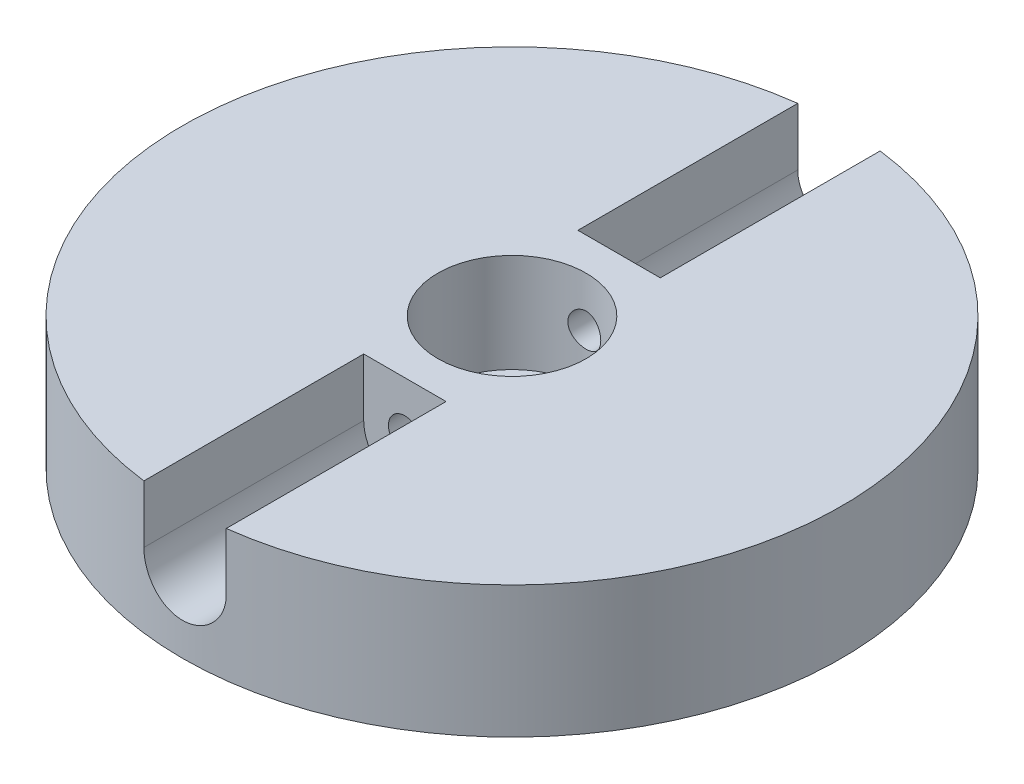
ISO-10303-21;
HEADER;
FILE_DESCRIPTION(('STEP AP214'),'2;1');
FILE_NAME('part.step','',(''),(''),'','','');
FILE_SCHEMA(('AUTOMOTIVE_DESIGN { 1 0 10303 214 1 1 1 1 }'));
ENDSEC;
DATA;
#1=APPLICATION_CONTEXT('core data for automotive mechanical design processes');
#2=APPLICATION_PROTOCOL_DEFINITION('international standard','automotive_design',2000,#1);
#3=PRODUCT_CONTEXT('',#1,'mechanical');
#4=PRODUCT('Part','Part','',(#3));
#5=PRODUCT_RELATED_PRODUCT_CATEGORY('part','',(#4));
#6=PRODUCT_DEFINITION_FORMATION('','',#4);
#7=PRODUCT_DEFINITION_CONTEXT('part definition',#1,'design');
#8=PRODUCT_DEFINITION('design','',#6,#7);
#9=PRODUCT_DEFINITION_SHAPE('','',#8);
#10=(LENGTH_UNIT() NAMED_UNIT(*) SI_UNIT(.MILLI.,.METRE.));
#11=(NAMED_UNIT(*) PLANE_ANGLE_UNIT() SI_UNIT($,.RADIAN.));
#12=(NAMED_UNIT(*) SI_UNIT($,.STERADIAN.) SOLID_ANGLE_UNIT());
#13=UNCERTAINTY_MEASURE_WITH_UNIT(LENGTH_MEASURE(1.E-05),#10,'distance_accuracy_value','');
#14=(GEOMETRIC_REPRESENTATION_CONTEXT(3) GLOBAL_UNCERTAINTY_ASSIGNED_CONTEXT((#13)) GLOBAL_UNIT_ASSIGNED_CONTEXT((#10,
#11,#12)) REPRESENTATION_CONTEXT('',''));
#15=CARTESIAN_POINT('',(0.,0.,0.));
#16=DIRECTION('',(0.,0.,1.));
#17=DIRECTION('',(1.,0.,0.));
#18=AXIS2_PLACEMENT_3D('',#15,#16,#17);
#19=CARTESIAN_POINT('',(0.,5.,20.));
#20=DIRECTION('',(0.,0.,-1.));
#21=DIRECTION('',(-1.,0.,0.));
#22=AXIS2_PLACEMENT_3D('',#19,#20,#21);
#23=CYLINDRICAL_SURFACE('',#22,1.);
#24=CARTESIAN_POINT('',(-1.,5.,4.38748219369606));
#25=CARTESIAN_POINT('',(-0.999998124740785,4.94457881615327,4.38748331342391));
#26=CARTESIAN_POINT('',(-0.995377065735324,4.88913529370352,4.38854372765849));
#27=CARTESIAN_POINT('',(-0.97703611833839,4.7798265869857,4.39266269613714));
#28=CARTESIAN_POINT('',(-0.963309788508039,4.72596254829799,4.39572266492455));
#29=CARTESIAN_POINT('',(-0.927213191558881,4.62140978885454,4.40347746164853));
#30=CARTESIAN_POINT('',(-0.904852584002373,4.57071759299695,4.40817046205988));
#31=CARTESIAN_POINT('',(-0.852150017177229,4.47380249647428,4.41866033160417));
#32=CARTESIAN_POINT('',(-0.821808168079242,4.4275795341293,4.42445718549953));
#33=CARTESIAN_POINT('',(-0.753440537295431,4.34010871431502,4.43661451639959));
#34=CARTESIAN_POINT('',(-0.715301848896048,4.29895011893993,4.44298239912488));
#35=CARTESIAN_POINT('',(-0.632666839431873,4.22355862378069,4.45549951724043));
#36=CARTESIAN_POINT('',(-0.588170014707601,4.18932627317823,4.46164873526093));
#37=CARTESIAN_POINT('',(-0.493481972618768,4.12840462430228,4.47311646400737));
#38=CARTESIAN_POINT('',(-0.443234108266534,4.10180137527342,4.47842521703683));
#39=CARTESIAN_POINT('',(-0.338843167825975,4.05745009913977,4.48753012167776));
#40=CARTESIAN_POINT('',(-0.284700544003477,4.0397010457645,4.49132644858096));
#41=CARTESIAN_POINT('',(-0.174985398164166,4.01384328353057,4.49692642233617));
#42=CARTESIAN_POINT('',(-0.11945011413096,4.0055834453998,4.49876127463464));
#43=CARTESIAN_POINT('',(-0.00775382889301121,3.99846586456379,4.50033974476021));
#44=CARTESIAN_POINT('',(0.0484070977382731,3.99960701303309,4.50008360921472));
#45=CARTESIAN_POINT('',(0.158717960467174,4.01114686124802,4.4975327467564));
#46=CARTESIAN_POINT('',(0.212885892163577,4.02138263954555,4.49527389802337));
#47=CARTESIAN_POINT('',(0.318715422771709,4.05056133377758,4.48901238651152));
#48=CARTESIAN_POINT('',(0.370376905871405,4.06950465162663,4.48500964324008));
#49=CARTESIAN_POINT('',(0.470176884695466,4.11570348705047,4.47565269302828));
#50=CARTESIAN_POINT('',(0.518286010447011,4.14302035827222,4.47028856276396));
#51=CARTESIAN_POINT('',(0.609296568272404,4.2051450469745,4.45879635842009));
#52=CARTESIAN_POINT('',(0.652197268314769,4.23995391553498,4.4526681771998));
#53=CARTESIAN_POINT('',(0.732542494790415,4.31696009692648,4.44016582863413));
#54=CARTESIAN_POINT('',(0.769850109238107,4.35929998798543,4.43378920480069));
#55=CARTESIAN_POINT('',(0.836861515102732,4.44970137380854,4.42163160720916));
#56=CARTESIAN_POINT('',(0.866565086744067,4.49776303388714,4.41585065067021));
#57=CARTESIAN_POINT('',(0.917588829579861,4.59846994417434,4.40553216782544));
#58=CARTESIAN_POINT('',(0.938882387203651,4.65112911140233,4.4009986024148));
#59=CARTESIAN_POINT('',(0.972276347615841,4.75940308564114,4.39374257045182));
#60=CARTESIAN_POINT('',(0.984378260852373,4.81501740542867,4.39101980634257));
#61=CARTESIAN_POINT('',(0.998831494501015,4.92636999352987,4.38775454247314));
#62=CARTESIAN_POINT('',(1.00138249383898,4.98208106551994,4.38716740125429));
#63=CARTESIAN_POINT('',(0.997202737121733,5.09313246148128,4.38811932262746));
#64=CARTESIAN_POINT('',(0.990472640937895,5.14847281152922,4.38965823406047));
#65=CARTESIAN_POINT('',(0.96809518661348,5.25651176874829,4.39464664137563));
#66=CARTESIAN_POINT('',(0.952558463272167,5.30923448764815,4.39807241834516));
#67=CARTESIAN_POINT('',(0.913128875693618,5.41132831556434,4.40642704252923));
#68=CARTESIAN_POINT('',(0.889235190550063,5.46069909474973,4.41135603739913));
#69=CARTESIAN_POINT('',(0.833332350832738,5.55554980088821,4.42225937025823));
#70=CARTESIAN_POINT('',(0.801200572354218,5.60095565749253,4.42824903821989));
#71=CARTESIAN_POINT('',(0.729893521468861,5.68580417870435,4.44055871006593));
#72=CARTESIAN_POINT('',(0.690717344765467,5.72524607651429,4.44687875628735));
#73=CARTESIAN_POINT('',(0.605528607307308,5.7978256717543,4.45928466963624));
#74=CARTESIAN_POINT('',(0.559398704918136,5.83082701793473,4.46536366365756));
#75=CARTESIAN_POINT('',(0.462134081071293,5.88861206711701,4.47647455721721));
#76=CARTESIAN_POINT('',(0.41099959740653,5.91339616031672,4.48150650647044));
#77=CARTESIAN_POINT('',(0.305500950001646,5.95385505731671,4.48992744359791));
#78=CARTESIAN_POINT('',(0.251160194087201,5.96958859794708,4.49332700109296));
#79=CARTESIAN_POINT('',(0.140522543397795,5.99168258000827,4.49814588349754));
#80=CARTESIAN_POINT('',(0.0842259439625949,5.99804443035693,4.49956550606412));
#81=CARTESIAN_POINT('',(-0.0274324227701901,6.00114939118448,4.50025537600146));
#82=CARTESIAN_POINT('',(-0.0827883528681099,5.99809581532961,4.49957105615266));
#83=CARTESIAN_POINT('',(-0.192177020683066,5.98291252472164,4.49622763231539));
#84=CARTESIAN_POINT('',(-0.246209783671608,5.97078298345254,4.49356856607352));
#85=CARTESIAN_POINT('',(-0.351255142393359,5.93789082140258,4.48657818532304));
#86=CARTESIAN_POINT('',(-0.402277441320411,5.91715788804941,4.48225262496609));
#87=CARTESIAN_POINT('',(-0.50014576404638,5.86767609823051,4.47239043658606));
#88=CARTESIAN_POINT('',(-0.546991367894835,5.83892643691077,4.46685368697546));
#89=CARTESIAN_POINT('',(-0.636165449755518,5.77356886126757,4.45503741308905));
#90=CARTESIAN_POINT('',(-0.678387879198456,5.7368184821519,4.44874549747429));
#91=CARTESIAN_POINT('',(-0.756135866174558,5.65678893177719,4.43619353584561));
#92=CARTESIAN_POINT('',(-0.791659799988317,5.61350818211755,4.42993349791575));
#93=CARTESIAN_POINT('',(-0.855479255716283,5.52092275009492,4.4180568509948));
#94=CARTESIAN_POINT('',(-0.883667429316084,5.47154269158522,4.41245039614391));
#95=CARTESIAN_POINT('',(-0.931300131649454,5.36863155226936,4.402644201522));
#96=CARTESIAN_POINT('',(-0.950751953872793,5.3151039779348,4.3984432890926));
#97=CARTESIAN_POINT('',(-0.976946747324326,5.21794676298002,4.39268810860696));
#98=CARTESIAN_POINT('',(-0.985574910239045,5.17483828636636,4.3907490225869));
#99=CARTESIAN_POINT('',(-0.997102130853924,5.08782452170681,4.38814565456081));
#100=CARTESIAN_POINT('',(-1.00000148607481,5.04391927516001,4.38748130635241));
#101=CARTESIAN_POINT('',(-1.,5.,4.38748219369606));
#102=B_SPLINE_CURVE_WITH_KNOTS('',3,(#24,#25,#26,#27,#28,#29,#30,#31,#32,#33,#34,#35,#36,#37,
#38,#39,#40,#41,#42,#43,#44,#45,#46,#47,#48,#49,#50,#51,#52,#53,#54,#55,#56,#57,#58,#59,#60,#61,
#62,#63,#64,#65,#66,#67,#68,#69,#70,#71,#72,#73,#74,#75,#76,#77,#78,#79,#80,#81,#82,#83,#84,#85,
#86,#87,#88,#89,#90,#91,#92,#93,#94,#95,#96,#97,#98,#99,#100,#101),.UNSPECIFIED.,.T.,.F.,(4,2,2,
2,2,2,2,2,2,2,2,2,2,2,2,2,2,2,2,2,2,2,2,2,2,2,2,2,2,2,2,2,2,2,2,2,2,2,4),(0.,0.166102558494592,
0.332322750192435,0.498357520008393,0.664389998050728,0.833022969567702,1.001669306751,
1.17214906318353,1.34260905508582,1.51031485736443,1.6780008793999,1.84274220917405,
2.00749114368964,2.17347729000196,2.33948673831992,2.5090602364594,2.67863863513816,
2.84874944722112,3.01883229921634,3.18533874755266,3.35183335815118,3.51628128972296,
3.68074537959259,3.84781614360498,4.01490836999235,4.18522523018715,4.35553400169376,
4.52472464724766,4.69388985448151,4.85942793779579,5.0249628569863,5.18993125886616,
5.35491622901636,5.52312234724343,5.69136918646788,5.86195485764065,6.03239785047427,
6.16403493145229,6.29566517579135),.UNSPECIFIED.);
#103=CARTESIAN_POINT('',(-1.,5.,4.38748219369606));
#104=VERTEX_POINT('',#103);
#105=EDGE_CURVE('E208',#104,#104,#102,.T.);
#106=ORIENTED_EDGE('',*,*,#105,.F.);
#107=EDGE_LOOP('',(#106));
#108=FACE_BOUND('',#107,.T.);
#109=CARTESIAN_POINT('',(0.,5.,6.5));
#110=DIRECTION('',(0.,0.,1.));
#111=DIRECTION('',(1.,0.,0.));
#112=AXIS2_PLACEMENT_3D('',#109,#110,#111);
#113=CIRCLE('',#112,1.);
#114=CARTESIAN_POINT('',(1.,5.,6.5));
#115=VERTEX_POINT('',#114);
#116=EDGE_CURVE('E150',#115,#115,#113,.T.);
#117=ORIENTED_EDGE('',*,*,#116,.T.);
#118=EDGE_LOOP('',(#117));
#119=FACE_BOUND('',#118,.T.);
#120=ADVANCED_FACE('F34',(#108,#119),#23,.F.);
#121=CARTESIAN_POINT('',(-1.,5.,-4.38748219369606));
#122=CARTESIAN_POINT('',(-0.999998124740785,5.05542118384673,-4.38748331342391));
#123=CARTESIAN_POINT('',(-0.995377065735324,5.11086470629648,-4.38854372765849));
#124=CARTESIAN_POINT('',(-0.97703611833839,5.2201734130143,-4.39266269613714));
#125=CARTESIAN_POINT('',(-0.963309788508039,5.27403745170201,-4.39572266492455));
#126=CARTESIAN_POINT('',(-0.927213191558881,5.37859021114546,-4.40347746164853));
#127=CARTESIAN_POINT('',(-0.904852584002373,5.42928240700305,-4.40817046205988));
#128=CARTESIAN_POINT('',(-0.852150017177229,5.52619750352572,-4.41866033160417));
#129=CARTESIAN_POINT('',(-0.821808168079242,5.5724204658707,-4.42445718549953));
#130=CARTESIAN_POINT('',(-0.75344053729543,5.65989128568498,-4.43661451639959));
#131=CARTESIAN_POINT('',(-0.715301848896047,5.70104988106007,-4.44298239912488));
#132=CARTESIAN_POINT('',(-0.632666839431872,5.77644137621931,-4.45549951724043));
#133=CARTESIAN_POINT('',(-0.588170014707601,5.81067372682177,-4.46164873526093));
#134=CARTESIAN_POINT('',(-0.493481972618768,5.87159537569772,-4.47311646400737));
#135=CARTESIAN_POINT('',(-0.443234108266533,5.89819862472658,-4.47842521703683));
#136=CARTESIAN_POINT('',(-0.338843167825975,5.94254990086023,-4.48753012167776));
#137=CARTESIAN_POINT('',(-0.284700544003477,5.9602989542355,-4.49132644858096));
#138=CARTESIAN_POINT('',(-0.174985398164166,5.98615671646943,-4.49692642233617));
#139=CARTESIAN_POINT('',(-0.11945011413096,5.9944165546002,-4.49876127463464));
#140=CARTESIAN_POINT('',(-0.00775382889301121,6.00153413543621,-4.50033974476021));
#141=CARTESIAN_POINT('',(0.0484070977382731,6.00039298696691,-4.50008360921472));
#142=CARTESIAN_POINT('',(0.158717960467174,5.98885313875198,-4.4975327467564));
#143=CARTESIAN_POINT('',(0.212885892163577,5.97861736045445,-4.49527389802337));
#144=CARTESIAN_POINT('',(0.318715422771709,5.94943866622242,-4.48901238651152));
#145=CARTESIAN_POINT('',(0.370376905871405,5.93049534837337,-4.48500964324008));
#146=CARTESIAN_POINT('',(0.470176884695466,5.88429651294953,-4.47565269302828));
#147=CARTESIAN_POINT('',(0.518286010447011,5.85697964172778,-4.47028856276396));
#148=CARTESIAN_POINT('',(0.609296568272404,5.7948549530255,-4.45879635842009));
#149=CARTESIAN_POINT('',(0.652197268314769,5.76004608446502,-4.4526681771998));
#150=CARTESIAN_POINT('',(0.732542494790415,5.68303990307352,-4.44016582863413));
#151=CARTESIAN_POINT('',(0.769850109238107,5.64070001201457,-4.43378920480069));
#152=CARTESIAN_POINT('',(0.836861515102732,5.55029862619146,-4.42163160720916));
#153=CARTESIAN_POINT('',(0.866565086744067,5.50223696611286,-4.41585065067021));
#154=CARTESIAN_POINT('',(0.917588829579861,5.40153005582566,-4.40553216782544));
#155=CARTESIAN_POINT('',(0.938882387203651,5.34887088859767,-4.4009986024148));
#156=CARTESIAN_POINT('',(0.972276347615841,5.24059691435886,-4.39374257045182));
#157=CARTESIAN_POINT('',(0.984378260852373,5.18498259457133,-4.39101980634257));
#158=CARTESIAN_POINT('',(0.998831494501015,5.07363000647013,-4.38775454247314));
#159=CARTESIAN_POINT('',(1.00138249383898,5.01791893448006,-4.38716740125429));
#160=CARTESIAN_POINT('',(0.997202737121733,4.90686753851872,-4.38811932262746));
#161=CARTESIAN_POINT('',(0.990472640937895,4.85152718847078,-4.38965823406047));
#162=CARTESIAN_POINT('',(0.96809518661348,4.74348823125171,-4.39464664137563));
#163=CARTESIAN_POINT('',(0.952558463272167,4.69076551235185,-4.39807241834516));
#164=CARTESIAN_POINT('',(0.913128875693618,4.58867168443566,-4.40642704252923));
#165=CARTESIAN_POINT('',(0.889235190550063,4.53930090525027,-4.41135603739913));
#166=CARTESIAN_POINT('',(0.833332350832738,4.44445019911179,-4.42225937025823));
#167=CARTESIAN_POINT('',(0.801200572354218,4.39904434250747,-4.42824903821989));
#168=CARTESIAN_POINT('',(0.729893521468861,4.31419582129565,-4.44055871006593));
#169=CARTESIAN_POINT('',(0.690717344765467,4.27475392348571,-4.44687875628735));
#170=CARTESIAN_POINT('',(0.605528607307308,4.2021743282457,-4.45928466963624));
#171=CARTESIAN_POINT('',(0.559398704918136,4.16917298206527,-4.46536366365756));
#172=CARTESIAN_POINT('',(0.462134081071293,4.11138793288299,-4.47647455721721));
#173=CARTESIAN_POINT('',(0.41099959740653,4.08660383968328,-4.48150650647044));
#174=CARTESIAN_POINT('',(0.305500950001646,4.04614494268329,-4.48992744359791));
#175=CARTESIAN_POINT('',(0.251160194087201,4.03041140205292,-4.49332700109296));
#176=CARTESIAN_POINT('',(0.140522543397795,4.00831741999173,-4.49814588349754));
#177=CARTESIAN_POINT('',(0.0842259439625949,4.00195556964307,-4.49956550606412));
#178=CARTESIAN_POINT('',(-0.0274324227701901,3.99885060881552,-4.50025537600146));
#179=CARTESIAN_POINT('',(-0.0827883528681099,4.00190418467039,-4.49957105615266));
#180=CARTESIAN_POINT('',(-0.192177020683066,4.01708747527836,-4.49622763231539));
#181=CARTESIAN_POINT('',(-0.246209783671608,4.02921701654746,-4.49356856607352));
#182=CARTESIAN_POINT('',(-0.351255142393359,4.06210917859742,-4.48657818532304));
#183=CARTESIAN_POINT('',(-0.402277441320411,4.08284211195059,-4.48225262496609));
#184=CARTESIAN_POINT('',(-0.50014576404638,4.13232390176949,-4.47239043658606));
#185=CARTESIAN_POINT('',(-0.546991367894835,4.16107356308923,-4.46685368697546));
#186=CARTESIAN_POINT('',(-0.636165449755518,4.22643113873243,-4.45503741308905));
#187=CARTESIAN_POINT('',(-0.678387879198456,4.2631815178481,-4.44874549747429));
#188=CARTESIAN_POINT('',(-0.756135866174558,4.34321106822281,-4.43619353584561));
#189=CARTESIAN_POINT('',(-0.791659799988317,4.38649181788245,-4.42993349791575));
#190=CARTESIAN_POINT('',(-0.855479255716283,4.47907724990508,-4.4180568509948));
#191=CARTESIAN_POINT('',(-0.883667429316084,4.52845730841478,-4.41245039614391));
#192=CARTESIAN_POINT('',(-0.931300131649454,4.63136844773064,-4.402644201522));
#193=CARTESIAN_POINT('',(-0.950751953872793,4.6848960220652,-4.3984432890926));
#194=CARTESIAN_POINT('',(-0.976946747324326,4.78205323701998,-4.39268810860696));
#195=CARTESIAN_POINT('',(-0.985574910239045,4.82516171363364,-4.3907490225869));
#196=CARTESIAN_POINT('',(-0.997102130853924,4.91217547829319,-4.38814565456081));
#197=CARTESIAN_POINT('',(-1.00000148607481,4.95608072483999,-4.38748130635241));
#198=CARTESIAN_POINT('',(-1.,5.,-4.38748219369606));
#199=B_SPLINE_CURVE_WITH_KNOTS('',3,(#121,#122,#123,#124,#125,#126,#127,#128,#129,#130,#131,
#132,#133,#134,#135,#136,#137,#138,#139,#140,#141,#142,#143,#144,#145,#146,#147,#148,#149,#150,
#151,#152,#153,#154,#155,#156,#157,#158,#159,#160,#161,#162,#163,#164,#165,#166,#167,#168,#169,
#170,#171,#172,#173,#174,#175,#176,#177,#178,#179,#180,#181,#182,#183,#184,#185,#186,#187,#188,
#189,#190,#191,#192,#193,#194,#195,#196,#197,#198),.UNSPECIFIED.,.T.,.F.,(4,2,2,2,2,2,2,2,2,2,2,
2,2,2,2,2,2,2,2,2,2,2,2,2,2,2,2,2,2,2,2,2,2,2,2,2,2,2,4),(0.,0.166102558494592,
0.332322750192435,0.498357520008393,0.664389998050728,0.833022969567703,1.001669306751,
1.17214906318353,1.34260905508582,1.51031485736443,1.6780008793999,1.84274220917405,
2.00749114368964,2.17347729000196,2.33948673831992,2.5090602364594,2.67863863513816,
2.84874944722112,3.01883229921634,3.18533874755266,3.35183335815118,3.51628128972296,
3.68074537959259,3.84781614360498,4.01490836999235,4.18522523018715,4.35553400169376,
4.52472464724766,4.69388985448151,4.85942793779579,5.0249628569863,5.18993125886616,
5.35491622901636,5.52312234724343,5.69136918646788,5.86195485764065,6.03239785047427,
6.16403493145229,6.29566517579135),.UNSPECIFIED.);
#200=CARTESIAN_POINT('',(-1.,5.,-4.38748219369606));
#201=VERTEX_POINT('',#200);
#202=EDGE_CURVE('E202',#201,#201,#199,.T.);
#203=ORIENTED_EDGE('',*,*,#202,.F.);
#204=EDGE_LOOP('',(#203));
#205=FACE_BOUND('',#204,.T.);
#206=CARTESIAN_POINT('',(0.,5.,-6.5));
#207=DIRECTION('',(0.,0.,1.));
#208=DIRECTION('',(1.,0.,0.));
#209=AXIS2_PLACEMENT_3D('',#206,#207,#208);
#210=CIRCLE('',#209,1.);
#211=CARTESIAN_POINT('',(1.,5.,-6.5));
#212=VERTEX_POINT('',#211);
#213=EDGE_CURVE('E129',#212,#212,#210,.T.);
#214=ORIENTED_EDGE('',*,*,#213,.F.);
#215=EDGE_LOOP('',(#214));
#216=FACE_BOUND('',#215,.T.);
#217=ADVANCED_FACE('F194',(#205,#216),#23,.F.);
#218=CARTESIAN_POINT('',(0.,8.,0.));
#219=DIRECTION('',(0.,-1.,0.));
#220=DIRECTION('',(0.,0.,-1.));
#221=AXIS2_PLACEMENT_3D('',#218,#219,#220);
#222=CYLINDRICAL_SURFACE('',#221,20.);
#223=CARTESIAN_POINT('',(0.,0.,0.));
#224=DIRECTION('',(0.,1.,0.));
#225=DIRECTION('',(0.,0.,1.));
#226=AXIS2_PLACEMENT_3D('',#223,#224,#225);
#227=CIRCLE('',#226,20.);
#228=CARTESIAN_POINT('',(0.,0.,20.));
#229=VERTEX_POINT('',#228);
#230=EDGE_CURVE('E165',#229,#229,#227,.T.);
#231=ORIENTED_EDGE('',*,*,#230,.T.);
#232=EDGE_LOOP('',(#231));
#233=FACE_BOUND('',#232,.T.);
#234=CARTESIAN_POINT('',(-2.5,4.5,-19.8431348329844));
#235=CARTESIAN_POINT('',(-2.50000705587245,4.42997747965463,-19.8431311662677));
#236=CARTESIAN_POINT('',(-2.49705815628674,4.35995852889184,-19.8435053985914));
#237=CARTESIAN_POINT('',(-2.48530310052497,4.22042699564741,-19.8449825584292));
#238=CARTESIAN_POINT('',(-2.4764973954152,4.15091437458717,-19.8460854298265));
#239=CARTESIAN_POINT('',(-2.45309534457857,4.01295440195228,-19.8489912854592));
#240=CARTESIAN_POINT('',(-2.4385049323959,3.94450603327392,-19.850793552264));
#241=CARTESIAN_POINT('',(-2.40365605276461,3.80910839487939,-19.8550432604224));
#242=CARTESIAN_POINT('',(-2.38339761903442,3.74215911624785,-19.8574906979379));
#243=CARTESIAN_POINT('',(-2.31429891753963,3.54422356805668,-19.8657042791123));
#244=CARTESIAN_POINT('',(-2.25712192228049,3.41607151103514,-19.8723434517049));
#245=CARTESIAN_POINT('',(-2.12226604877552,3.17126170834563,-19.8871957936628));
#246=CARTESIAN_POINT('',(-2.04458877031132,3.05460306674055,-19.8954088401939));
#247=CARTESIAN_POINT('',(-1.87045938279267,2.83534897525874,-19.9125350648406));
#248=CARTESIAN_POINT('',(-1.77391714203987,2.73282523604605,-19.9214514764077));
#249=CARTESIAN_POINT('',(-1.56498643345422,2.5453844803003,-19.9389514682075));
#250=CARTESIAN_POINT('',(-1.45259555468916,2.46047014741628,-19.9475349975476));
#251=CARTESIAN_POINT('',(-1.214706393226,2.31040458699592,-19.9634346765627));
#252=CARTESIAN_POINT('',(-1.08916626423033,2.24531919974403,-19.9707465701283));
#253=CARTESIAN_POINT('',(-0.828838688894571,2.13718613321402,-19.9832426801271));
#254=CARTESIAN_POINT('',(-0.694052134142187,2.09413633252956,-19.9884271013664));
#255=CARTESIAN_POINT('',(-0.419797360424771,2.03150834114316,-19.9960616400867));
#256=CARTESIAN_POINT('',(-0.280357251397322,2.01180880571184,-19.9985258888961));
#257=CARTESIAN_POINT('',(-0.000126617952758739,1.9960645132963,-20.0004907090065));
#258=CARTESIAN_POINT('',(0.140663885999254,2.0000193983954,-19.9999913251504));
#259=CARTESIAN_POINT('',(0.418765649166527,2.03137524462261,-19.9960964724282));
#260=CARTESIAN_POINT('',(0.556091956322551,2.05864503834841,-19.9927172058431));
#261=CARTESIAN_POINT('',(0.824202877106962,2.13565145718534,-19.9834605275911));
#262=CARTESIAN_POINT('',(0.95498740193327,2.18538838718698,-19.9775830820227));
#263=CARTESIAN_POINT('',(1.2067114779282,2.30605773148688,-19.9639624334742));
#264=CARTESIAN_POINT('',(1.32762333988945,2.37704731709528,-19.956214208971));
#265=CARTESIAN_POINT('',(1.55586201456091,2.53816233202027,-19.9397193209485));
#266=CARTESIAN_POINT('',(1.66318877794007,2.62828783082117,-19.9309726538038));
#267=CARTESIAN_POINT('',(1.86197334195269,2.82583668956777,-19.9133899683575));
#268=CARTESIAN_POINT('',(1.95331986184763,2.93337203032696,-19.9045537442681));
#269=CARTESIAN_POINT('',(2.11671168044544,3.1623478104926,-19.8878430578794));
#270=CARTESIAN_POINT('',(2.18875124212915,3.28379236772412,-19.8799688818279));
#271=CARTESIAN_POINT('',(2.31148922630024,3.53725472442116,-19.8660728803675));
#272=CARTESIAN_POINT('',(2.36216602491078,3.66928307697555,-19.8600529335035));
#273=CARTESIAN_POINT('',(2.44052371572056,3.93997201154575,-19.8505775219723));
#274=CARTESIAN_POINT('',(2.46823923788994,4.07862227117801,-19.8471181962442));
#275=CARTESIAN_POINT('',(2.48939950751491,4.26522517653427,-19.84446778956));
#276=CARTESIAN_POINT('',(2.49337657770223,4.31213226867885,-19.8439682860664));
#277=CARTESIAN_POINT('',(2.49867326875582,4.40601961812816,-19.8433021964308));
#278=CARTESIAN_POINT('',(2.49999734299401,4.45299962011769,-19.8431350523872));
#279=CARTESIAN_POINT('',(2.5,4.5,-19.8431348329844));
#280=B_SPLINE_CURVE_WITH_KNOTS('',3,(#234,#235,#236,#237,#238,#239,#240,#241,#242,#243,#244,
#245,#246,#247,#248,#249,#250,#251,#252,#253,#254,#255,#256,#257,#258,#259,#260,#261,#262,#263,
#264,#265,#266,#267,#268,#269,#270,#271,#272,#273,#274,#275,#276,#277,#278,#279),.UNSPECIFIED.,
.F.,.F.,(4,2,2,2,2,2,2,2,2,2,2,2,2,2,2,2,2,2,2,2,2,2,4),(0.,0.209998142386608,0.419980113480384,
0.629747254819297,0.839513148302787,1.25881025566885,1.67807465199564,2.09939344525895,
2.52077639981135,2.94354364202947,3.36627017601096,3.78679015160277,4.2073037642939,
4.62546705936317,5.04363602929234,5.46294017194921,5.88224583716518,6.30436426112369,
6.7266079778993,7.14927807905319,7.57130954683698,7.712488213468,7.85342969556331),.UNSPECIFIED.);
#281=CARTESIAN_POINT('',(-2.5,4.5,-19.8431348329844));
#282=VERTEX_POINT('',#281);
#283=CARTESIAN_POINT('',(2.5,4.5,-19.8431348329844));
#284=VERTEX_POINT('',#283);
#285=EDGE_CURVE('E11',#282,#284,#280,.T.);
#286=ORIENTED_EDGE('',*,*,#285,.T.);
#287=DIRECTION('',(0.,-1.,0.));
#288=VECTOR('',#287,1.);
#289=CARTESIAN_POINT('',(2.5,8.,-19.8431348329844));
#290=LINE('',#289,#288);
#291=CARTESIAN_POINT('',(2.5,8.,-19.8431348329844));
#292=VERTEX_POINT('',#291);
#293=EDGE_CURVE('E135',#284,#292,#290,.F.);
#294=ORIENTED_EDGE('',*,*,#293,.T.);
#295=CARTESIAN_POINT('',(0.,8.,0.));
#296=DIRECTION('',(0.,1.,0.));
#297=DIRECTION('',(0.,0.,1.));
#298=AXIS2_PLACEMENT_3D('',#295,#296,#297);
#299=CIRCLE('',#298,20.);
#300=CARTESIAN_POINT('',(2.5,8.,19.8431348329844));
#301=VERTEX_POINT('',#300);
#302=EDGE_CURVE('E166',#301,#292,#299,.T.);
#303=ORIENTED_EDGE('',*,*,#302,.F.);
#304=DIRECTION('',(0.,-1.,0.));
#305=VECTOR('',#304,1.);
#306=CARTESIAN_POINT('',(2.5,8.,19.8431348329844));
#307=LINE('',#306,#305);
#308=CARTESIAN_POINT('',(2.5,4.5,19.8431348329844));
#309=VERTEX_POINT('',#308);
#310=EDGE_CURVE('E159',#301,#309,#307,.T.);
#311=ORIENTED_EDGE('',*,*,#310,.T.);
#312=CARTESIAN_POINT('',(2.5,4.5,19.8431348329844));
#313=CARTESIAN_POINT('',(2.50000705587245,4.42997747965463,19.8431311662677));
#314=CARTESIAN_POINT('',(2.49705815628674,4.35995852889184,19.8435053985914));
#315=CARTESIAN_POINT('',(2.48530310052497,4.22042699564741,19.8449825584292));
#316=CARTESIAN_POINT('',(2.47649739541519,4.15091437458717,19.8460854298265));
#317=CARTESIAN_POINT('',(2.45309534457857,4.01295440195228,19.8489912854592));
#318=CARTESIAN_POINT('',(2.4385049323959,3.94450603327392,19.850793552264));
#319=CARTESIAN_POINT('',(2.40365605276461,3.80910839487939,19.8550432604224));
#320=CARTESIAN_POINT('',(2.38339761903442,3.74215911624785,19.8574906979379));
#321=CARTESIAN_POINT('',(2.31429891753963,3.54422356805668,19.8657042791123));
#322=CARTESIAN_POINT('',(2.25712192228049,3.41607151103515,19.8723434517049));
#323=CARTESIAN_POINT('',(2.12226604877552,3.17126170834563,19.8871957936628));
#324=CARTESIAN_POINT('',(2.04458877031132,3.05460306674055,19.8954088401939));
#325=CARTESIAN_POINT('',(1.87045938279267,2.83534897525874,19.9125350648406));
#326=CARTESIAN_POINT('',(1.77391714203987,2.73282523604605,19.9214514764077));
#327=CARTESIAN_POINT('',(1.56498643345422,2.5453844803003,19.9389514682075));
#328=CARTESIAN_POINT('',(1.45259555468916,2.46047014741628,19.9475349975476));
#329=CARTESIAN_POINT('',(1.214706393226,2.31040458699593,19.9634346765627));
#330=CARTESIAN_POINT('',(1.08916626423033,2.24531919974404,19.9707465701283));
#331=CARTESIAN_POINT('',(0.828838688894572,2.13718613321402,19.9832426801271));
#332=CARTESIAN_POINT('',(0.694052134142187,2.09413633252956,19.9884271013664));
#333=CARTESIAN_POINT('',(0.419797360424772,2.03150834114316,19.9960616400867));
#334=CARTESIAN_POINT('',(0.280357251397323,2.01180880571185,19.9985258888961));
#335=CARTESIAN_POINT('',(0.000126617952759443,1.9960645132963,20.0004907090065));
#336=CARTESIAN_POINT('',(-0.140663885999253,2.0000193983954,19.9999913251504));
#337=CARTESIAN_POINT('',(-0.418765649166526,2.03137524462261,19.9960964724282));
#338=CARTESIAN_POINT('',(-0.556091956322551,2.05864503834841,19.9927172058431));
#339=CARTESIAN_POINT('',(-0.824202877106962,2.13565145718534,19.9834605275911));
#340=CARTESIAN_POINT('',(-0.954987401933269,2.18538838718698,19.9775830820227));
#341=CARTESIAN_POINT('',(-1.2067114779282,2.30605773148688,19.9639624334742));
#342=CARTESIAN_POINT('',(-1.32762333988945,2.37704731709528,19.956214208971));
#343=CARTESIAN_POINT('',(-1.5558620145609,2.53816233202027,19.9397193209485));
#344=CARTESIAN_POINT('',(-1.66318877794007,2.62828783082117,19.9309726538038));
#345=CARTESIAN_POINT('',(-1.86197334195269,2.82583668956778,19.9133899683575));
#346=CARTESIAN_POINT('',(-1.95331986184763,2.93337203032696,19.9045537442681));
#347=CARTESIAN_POINT('',(-2.11671168044544,3.1623478104926,19.8878430578794));
#348=CARTESIAN_POINT('',(-2.18875124212915,3.28379236772412,19.8799688818279));
#349=CARTESIAN_POINT('',(-2.31148922630024,3.53725472442116,19.8660728803675));
#350=CARTESIAN_POINT('',(-2.36216602491078,3.66928307697555,19.8600529335035));
#351=CARTESIAN_POINT('',(-2.44052371572056,3.93997201154575,19.8505775219723));
#352=CARTESIAN_POINT('',(-2.46823923788994,4.07862227117801,19.8471181962442));
#353=CARTESIAN_POINT('',(-2.48939950751491,4.26522517653427,19.84446778956));
#354=CARTESIAN_POINT('',(-2.49337657770223,4.31213226867886,19.8439682860664));
#355=CARTESIAN_POINT('',(-2.49867326875582,4.40601961812816,19.8433021964308));
#356=CARTESIAN_POINT('',(-2.49999734299401,4.45299962011769,19.8431350523872));
#357=CARTESIAN_POINT('',(-2.5,4.5,19.8431348329844));
#358=B_SPLINE_CURVE_WITH_KNOTS('',3,(#312,#313,#314,#315,#316,#317,#318,#319,#320,#321,#322,
#323,#324,#325,#326,#327,#328,#329,#330,#331,#332,#333,#334,#335,#336,#337,#338,#339,#340,#341,
#342,#343,#344,#345,#346,#347,#348,#349,#350,#351,#352,#353,#354,#355,#356,#357),.UNSPECIFIED.,
.F.,.F.,(4,2,2,2,2,2,2,2,2,2,2,2,2,2,2,2,2,2,2,2,2,2,4),(0.,0.209998142386609,0.419980113480383,
0.629747254819297,0.839513148302787,1.25881025566885,1.67807465199564,2.09939344525895,
2.52077639981135,2.94354364202947,3.36627017601095,3.78679015160277,4.2073037642939,
4.62546705936317,5.04363602929234,5.46294017194921,5.88224583716518,6.30436426112369,
6.7266079778993,7.14927807905319,7.57130954683698,7.712488213468,7.85342969556331),.UNSPECIFIED.);
#359=CARTESIAN_POINT('',(-2.5,4.5,19.8431348329844));
#360=VERTEX_POINT('',#359);
#361=EDGE_CURVE('E169',#309,#360,#358,.T.);
#362=ORIENTED_EDGE('',*,*,#361,.T.);
#363=DIRECTION('',(0.,-1.,0.));
#364=VECTOR('',#363,1.);
#365=CARTESIAN_POINT('',(-2.5,8.,19.8431348329844));
#366=LINE('',#365,#364);
#367=CARTESIAN_POINT('',(-2.5,8.,19.8431348329844));
#368=VERTEX_POINT('',#367);
#369=EDGE_CURVE('E162',#360,#368,#366,.F.);
#370=ORIENTED_EDGE('',*,*,#369,.T.);
#371=CARTESIAN_POINT('',(-2.5,8.,-19.8431348329844));
#372=VERTEX_POINT('',#371);
#373=EDGE_CURVE('E170',#372,#368,#299,.T.);
#374=ORIENTED_EDGE('',*,*,#373,.F.);
#375=DIRECTION('',(0.,-1.,0.));
#376=VECTOR('',#375,1.);
#377=CARTESIAN_POINT('',(-2.5,8.,-19.8431348329844));
#378=LINE('',#377,#376);
#379=EDGE_CURVE('E133',#282,#372,#378,.F.);
#380=ORIENTED_EDGE('',*,*,#379,.F.);
#381=EDGE_LOOP('',(#286,#294,#303,#311,#362,#370,#374,#380));
#382=FACE_BOUND('',#381,.T.);
#383=ADVANCED_FACE('F36',(#233,#382),#222,.T.);
#384=CARTESIAN_POINT('',(0.,8.,0.));
#385=DIRECTION('',(0.,1.,0.));
#386=DIRECTION('',(0.,0.,1.));
#387=AXIS2_PLACEMENT_3D('',#384,#385,#386);
#388=PLANE('',#387);
#389=CARTESIAN_POINT('',(0.,8.,0.));
#390=DIRECTION('',(0.,1.,0.));
#391=DIRECTION('',(0.,0.,1.));
#392=AXIS2_PLACEMENT_3D('',#389,#390,#391);
#393=CIRCLE('',#392,4.5);
#394=CARTESIAN_POINT('',(0.,8.,4.5));
#395=VERTEX_POINT('',#394);
#396=EDGE_CURVE('E255',#395,#395,#393,.T.);
#397=ORIENTED_EDGE('',*,*,#396,.F.);
#398=EDGE_LOOP('',(#397));
#399=FACE_BOUND('',#398,.T.);
#400=DIRECTION('',(0.,0.,-1.));
#401=VECTOR('',#400,1.);
#402=CARTESIAN_POINT('',(2.5,8.,0.));
#403=LINE('',#402,#401);
#404=CARTESIAN_POINT('',(2.5,8.,-6.5));
#405=VERTEX_POINT('',#404);
#406=EDGE_CURVE('E47',#405,#292,#403,.T.);
#407=ORIENTED_EDGE('',*,*,#406,.F.);
#408=DIRECTION('',(1.,0.,0.));
#409=VECTOR('',#408,1.);
#410=CARTESIAN_POINT('',(0.,8.,-6.5));
#411=LINE('',#410,#409);
#412=CARTESIAN_POINT('',(-2.5,8.,-6.5));
#413=VERTEX_POINT('',#412);
#414=EDGE_CURVE('E121',#413,#405,#411,.T.);
#415=ORIENTED_EDGE('',*,*,#414,.F.);
#416=DIRECTION('',(0.,0.,-1.));
#417=VECTOR('',#416,1.);
#418=CARTESIAN_POINT('',(-2.5,8.,0.));
#419=LINE('',#418,#417);
#420=EDGE_CURVE('E119',#413,#372,#419,.T.);
#421=ORIENTED_EDGE('',*,*,#420,.T.);
#422=ORIENTED_EDGE('',*,*,#373,.T.);
#423=DIRECTION('',(0.,0.,1.));
#424=VECTOR('',#423,1.);
#425=CARTESIAN_POINT('',(-2.5,8.,6.5));
#426=LINE('',#425,#424);
#427=CARTESIAN_POINT('',(-2.5,8.,6.5));
#428=VERTEX_POINT('',#427);
#429=EDGE_CURVE('E147',#428,#368,#426,.T.);
#430=ORIENTED_EDGE('',*,*,#429,.F.);
#431=DIRECTION('',(-1.,0.,0.));
#432=VECTOR('',#431,1.);
#433=CARTESIAN_POINT('',(0.,8.,6.5));
#434=LINE('',#433,#432);
#435=CARTESIAN_POINT('',(2.5,8.,6.5));
#436=VERTEX_POINT('',#435);
#437=EDGE_CURVE('E144',#436,#428,#434,.T.);
#438=ORIENTED_EDGE('',*,*,#437,.F.);
#439=DIRECTION('',(0.,0.,1.));
#440=VECTOR('',#439,1.);
#441=CARTESIAN_POINT('',(2.5,8.,6.5));
#442=LINE('',#441,#440);
#443=EDGE_CURVE('E151',#436,#301,#442,.T.);
#444=ORIENTED_EDGE('',*,*,#443,.T.);
#445=ORIENTED_EDGE('',*,*,#302,.T.);
#446=EDGE_LOOP('',(#407,#415,#421,#422,#430,#438,#444,#445));
#447=FACE_BOUND('',#446,.T.);
#448=ADVANCED_FACE('F199',(#399,#447),#388,.T.);
#449=CARTESIAN_POINT('',(0.,0.,0.));
#450=DIRECTION('',(0.,1.,0.));
#451=DIRECTION('',(0.,0.,1.));
#452=AXIS2_PLACEMENT_3D('',#449,#450,#451);
#453=PLANE('',#452);
#454=CARTESIAN_POINT('',(-8.48528137423856,0.,8.48528137423858));
#455=DIRECTION('',(0.,-1.,0.));
#456=DIRECTION('',(0.,0.,-1.));
#457=AXIS2_PLACEMENT_3D('',#454,#455,#456);
#458=CIRCLE('',#457,1.5);
#459=CARTESIAN_POINT('',(-8.48528137423856,0.,6.98528137423858));
#460=VERTEX_POINT('',#459);
#461=EDGE_CURVE('E266',#460,#460,#458,.T.);
#462=ORIENTED_EDGE('',*,*,#461,.F.);
#463=EDGE_LOOP('',(#462));
#464=FACE_BOUND('',#463,.T.);
#465=CARTESIAN_POINT('',(-8.4852813742381,0.,-8.48528137423856));
#466=DIRECTION('',(0.,-1.,0.));
#467=DIRECTION('',(0.,0.,-1.));
#468=AXIS2_PLACEMENT_3D('',#465,#466,#467);
#469=CIRCLE('',#468,1.50000000000025);
#470=CARTESIAN_POINT('',(-8.4852813742381,0.,-9.98528137423881));
#471=VERTEX_POINT('',#470);
#472=EDGE_CURVE('E272',#471,#471,#469,.T.);
#473=ORIENTED_EDGE('',*,*,#472,.F.);
#474=EDGE_LOOP('',(#473));
#475=FACE_BOUND('',#474,.T.);
#476=CARTESIAN_POINT('',(8.48528137423903,0.,-8.4852813742381));
#477=DIRECTION('',(0.,-1.,0.));
#478=DIRECTION('',(0.,0.,-1.));
#479=AXIS2_PLACEMENT_3D('',#476,#477,#478);
#480=CIRCLE('',#479,1.50000000000067);
#481=CARTESIAN_POINT('',(8.48528137423903,0.,-9.98528137423877));
#482=VERTEX_POINT('',#481);
#483=EDGE_CURVE('E278',#482,#482,#480,.T.);
#484=ORIENTED_EDGE('',*,*,#483,.F.);
#485=EDGE_LOOP('',(#484));
#486=FACE_BOUND('',#485,.T.);
#487=CARTESIAN_POINT('',(8.48528137423858,0.,8.48528137423903));
#488=DIRECTION('',(0.,-1.,0.));
#489=DIRECTION('',(0.,0.,-1.));
#490=AXIS2_PLACEMENT_3D('',#487,#488,#489);
#491=CIRCLE('',#490,1.50000000000049);
#492=CARTESIAN_POINT('',(8.48528137423858,0.,6.98528137423854));
#493=VERTEX_POINT('',#492);
#494=EDGE_CURVE('E260',#493,#493,#491,.T.);
#495=ORIENTED_EDGE('',*,*,#494,.F.);
#496=EDGE_LOOP('',(#495));
#497=FACE_BOUND('',#496,.T.);
#498=ORIENTED_EDGE('',*,*,#230,.F.);
#499=EDGE_LOOP('',(#498));
#500=FACE_BOUND('',#499,.T.);
#501=ADVANCED_FACE('F187',(#464,#475,#486,#497,#500),#453,.F.);
#502=CARTESIAN_POINT('',(0.,4.5,6.5));
#503=DIRECTION('',(0.,0.,1.));
#504=DIRECTION('',(1.,0.,0.));
#505=AXIS2_PLACEMENT_3D('',#502,#503,#504);
#506=CYLINDRICAL_SURFACE('',#505,2.5);
#507=DIRECTION('',(0.,0.,1.));
#508=VECTOR('',#507,1.);
#509=CARTESIAN_POINT('',(2.5,4.5,6.5));
#510=LINE('',#509,#508);
#511=CARTESIAN_POINT('',(2.5,4.5,6.5));
#512=VERTEX_POINT('',#511);
#513=EDGE_CURVE('E154',#512,#309,#510,.T.);
#514=ORIENTED_EDGE('',*,*,#513,.F.);
#515=CARTESIAN_POINT('',(0.,4.5,6.5));
#516=DIRECTION('',(0.,0.,1.));
#517=DIRECTION('',(1.,0.,0.));
#518=AXIS2_PLACEMENT_3D('',#515,#516,#517);
#519=CIRCLE('',#518,2.5);
#520=CARTESIAN_POINT('',(-2.5,4.5,6.5));
#521=VERTEX_POINT('',#520);
#522=EDGE_CURVE('E141',#521,#512,#519,.T.);
#523=ORIENTED_EDGE('',*,*,#522,.F.);
#524=DIRECTION('',(0.,0.,1.));
#525=VECTOR('',#524,1.);
#526=CARTESIAN_POINT('',(-2.5,4.5,6.5));
#527=LINE('',#526,#525);
#528=EDGE_CURVE('E146',#521,#360,#527,.T.);
#529=ORIENTED_EDGE('',*,*,#528,.T.);
#530=ORIENTED_EDGE('',*,*,#361,.F.);
#531=EDGE_LOOP('',(#514,#523,#529,#530));
#532=FACE_BOUND('',#531,.T.);
#533=ADVANCED_FACE('F181',(#532),#506,.F.);
#534=CARTESIAN_POINT('',(-2.5,0.,6.5));
#535=DIRECTION('',(-1.,0.,0.));
#536=DIRECTION('',(0.,0.,1.));
#537=AXIS2_PLACEMENT_3D('',#534,#535,#536);
#538=PLANE('',#537);
#539=ORIENTED_EDGE('',*,*,#528,.F.);
#540=DIRECTION('',(0.,-1.,0.));
#541=VECTOR('',#540,1.);
#542=CARTESIAN_POINT('',(-2.5,0.,6.5));
#543=LINE('',#542,#541);
#544=EDGE_CURVE('E138',#428,#521,#543,.T.);
#545=ORIENTED_EDGE('',*,*,#544,.F.);
#546=ORIENTED_EDGE('',*,*,#429,.T.);
#547=ORIENTED_EDGE('',*,*,#369,.F.);
#548=EDGE_LOOP('',(#539,#545,#546,#547));
#549=FACE_BOUND('',#548,.T.);
#550=ADVANCED_FACE('F186',(#549),#538,.F.);
#551=CARTESIAN_POINT('',(2.5,0.,6.5));
#552=DIRECTION('',(1.,0.,0.));
#553=DIRECTION('',(0.,1.,0.));
#554=AXIS2_PLACEMENT_3D('',#551,#552,#553);
#555=PLANE('',#554);
#556=ORIENTED_EDGE('',*,*,#443,.F.);
#557=DIRECTION('',(0.,1.,0.));
#558=VECTOR('',#557,1.);
#559=CARTESIAN_POINT('',(2.5,0.,6.5));
#560=LINE('',#559,#558);
#561=EDGE_CURVE('E62',#512,#436,#560,.T.);
#562=ORIENTED_EDGE('',*,*,#561,.F.);
#563=ORIENTED_EDGE('',*,*,#513,.T.);
#564=ORIENTED_EDGE('',*,*,#310,.F.);
#565=EDGE_LOOP('',(#556,#562,#563,#564));
#566=FACE_BOUND('',#565,.T.);
#567=ADVANCED_FACE('F189',(#566),#555,.F.);
#568=CARTESIAN_POINT('',(0.,0.,6.5));
#569=DIRECTION('',(0.,0.,1.));
#570=DIRECTION('',(1.,0.,0.));
#571=AXIS2_PLACEMENT_3D('',#568,#569,#570);
#572=PLANE('',#571);
#573=ORIENTED_EDGE('',*,*,#116,.F.);
#574=EDGE_LOOP('',(#573));
#575=FACE_BOUND('',#574,.T.);
#576=ORIENTED_EDGE('',*,*,#544,.T.);
#577=ORIENTED_EDGE('',*,*,#522,.T.);
#578=ORIENTED_EDGE('',*,*,#561,.T.);
#579=ORIENTED_EDGE('',*,*,#437,.T.);
#580=EDGE_LOOP('',(#576,#577,#578,#579));
#581=FACE_BOUND('',#580,.T.);
#582=ADVANCED_FACE('F230',(#575,#581),#572,.T.);
#583=CARTESIAN_POINT('',(0.,4.5,-21.5));
#584=DIRECTION('',(0.,0.,1.));
#585=DIRECTION('',(1.,0.,0.));
#586=AXIS2_PLACEMENT_3D('',#583,#584,#585);
#587=CYLINDRICAL_SURFACE('',#586,2.5);
#588=DIRECTION('',(0.,0.,1.));
#589=VECTOR('',#588,1.);
#590=CARTESIAN_POINT('',(-2.5,4.5,-21.5));
#591=LINE('',#590,#589);
#592=CARTESIAN_POINT('',(-2.5,4.5,-6.5));
#593=VERTEX_POINT('',#592);
#594=EDGE_CURVE('E107',#282,#593,#591,.T.);
#595=ORIENTED_EDGE('',*,*,#594,.T.);
#596=CARTESIAN_POINT('',(0.,4.5,-6.5));
#597=DIRECTION('',(0.,0.,1.));
#598=DIRECTION('',(1.,0.,0.));
#599=AXIS2_PLACEMENT_3D('',#596,#597,#598);
#600=CIRCLE('',#599,2.5);
#601=CARTESIAN_POINT('',(2.5,4.5,-6.5));
#602=VERTEX_POINT('',#601);
#603=EDGE_CURVE('E110',#593,#602,#600,.T.);
#604=ORIENTED_EDGE('',*,*,#603,.T.);
#605=DIRECTION('',(0.,0.,1.));
#606=VECTOR('',#605,1.);
#607=CARTESIAN_POINT('',(2.5,4.5,-21.5));
#608=LINE('',#607,#606);
#609=EDGE_CURVE('E114',#284,#602,#608,.T.);
#610=ORIENTED_EDGE('',*,*,#609,.F.);
#611=ORIENTED_EDGE('',*,*,#285,.F.);
#612=EDGE_LOOP('',(#595,#604,#610,#611));
#613=FACE_BOUND('',#612,.T.);
#614=ADVANCED_FACE('F108',(#613),#587,.F.);
#615=CARTESIAN_POINT('',(2.5,0.,-21.5));
#616=DIRECTION('',(1.,0.,0.));
#617=DIRECTION('',(0.,0.,-1.));
#618=AXIS2_PLACEMENT_3D('',#615,#616,#617);
#619=PLANE('',#618);
#620=ORIENTED_EDGE('',*,*,#609,.T.);
#621=DIRECTION('',(0.,1.,0.));
#622=VECTOR('',#621,1.);
#623=CARTESIAN_POINT('',(2.5,0.,-6.5));
#624=LINE('',#623,#622);
#625=EDGE_CURVE('E115',#602,#405,#624,.T.);
#626=ORIENTED_EDGE('',*,*,#625,.T.);
#627=ORIENTED_EDGE('',*,*,#406,.T.);
#628=ORIENTED_EDGE('',*,*,#293,.F.);
#629=EDGE_LOOP('',(#620,#626,#627,#628));
#630=FACE_BOUND('',#629,.T.);
#631=ADVANCED_FACE('F224',(#630),#619,.F.);
#632=CARTESIAN_POINT('',(-2.5,0.,-21.5));
#633=DIRECTION('',(1.,0.,0.));
#634=DIRECTION('',(0.,0.,-1.));
#635=AXIS2_PLACEMENT_3D('',#632,#633,#634);
#636=PLANE('',#635);
#637=ORIENTED_EDGE('',*,*,#379,.T.);
#638=ORIENTED_EDGE('',*,*,#420,.F.);
#639=DIRECTION('',(0.,1.,0.));
#640=VECTOR('',#639,1.);
#641=CARTESIAN_POINT('',(-2.5,0.,-6.5));
#642=LINE('',#641,#640);
#643=EDGE_CURVE('E54',#593,#413,#642,.T.);
#644=ORIENTED_EDGE('',*,*,#643,.F.);
#645=ORIENTED_EDGE('',*,*,#594,.F.);
#646=EDGE_LOOP('',(#637,#638,#644,#645));
#647=FACE_BOUND('',#646,.T.);
#648=ADVANCED_FACE('F117',(#647),#636,.T.);
#649=CARTESIAN_POINT('',(0.,0.,-6.5));
#650=DIRECTION('',(0.,0.,1.));
#651=DIRECTION('',(1.,0.,0.));
#652=AXIS2_PLACEMENT_3D('',#649,#650,#651);
#653=PLANE('',#652);
#654=ORIENTED_EDGE('',*,*,#213,.T.);
#655=EDGE_LOOP('',(#654));
#656=FACE_BOUND('',#655,.T.);
#657=ORIENTED_EDGE('',*,*,#414,.T.);
#658=ORIENTED_EDGE('',*,*,#625,.F.);
#659=ORIENTED_EDGE('',*,*,#603,.F.);
#660=ORIENTED_EDGE('',*,*,#643,.T.);
#661=EDGE_LOOP('',(#657,#658,#659,#660));
#662=FACE_BOUND('',#661,.T.);
#663=ADVANCED_FACE('F123',(#656,#662),#653,.F.);
#664=CARTESIAN_POINT('',(0.,2.,0.));
#665=DIRECTION('',(0.,1.,0.));
#666=DIRECTION('',(0.,0.,1.));
#667=AXIS2_PLACEMENT_3D('',#664,#665,#666);
#668=CYLINDRICAL_SURFACE('',#667,4.5);
#669=ORIENTED_EDGE('',*,*,#105,.T.);
#670=EDGE_LOOP('',(#669));
#671=FACE_BOUND('',#670,.T.);
#672=ORIENTED_EDGE('',*,*,#202,.T.);
#673=EDGE_LOOP('',(#672));
#674=FACE_BOUND('',#673,.T.);
#675=CARTESIAN_POINT('',(0.,2.,0.));
#676=DIRECTION('',(0.,1.,0.));
#677=DIRECTION('',(0.,0.,1.));
#678=AXIS2_PLACEMENT_3D('',#675,#676,#677);
#679=CIRCLE('',#678,4.5);
#680=CARTESIAN_POINT('',(0.,2.,4.5));
#681=VERTEX_POINT('',#680);
#682=EDGE_CURVE('E252',#681,#681,#679,.T.);
#683=ORIENTED_EDGE('',*,*,#682,.F.);
#684=EDGE_LOOP('',(#683));
#685=FACE_BOUND('',#684,.T.);
#686=ORIENTED_EDGE('',*,*,#396,.T.);
#687=EDGE_LOOP('',(#686));
#688=FACE_BOUND('',#687,.T.);
#689=ADVANCED_FACE('F212',(#671,#674,#685,#688),#668,.F.);
#690=CARTESIAN_POINT('',(0.,2.,0.));
#691=DIRECTION('',(0.,1.,0.));
#692=DIRECTION('',(0.,0.,1.));
#693=AXIS2_PLACEMENT_3D('',#690,#691,#692);
#694=PLANE('',#693);
#695=ORIENTED_EDGE('',*,*,#682,.T.);
#696=EDGE_LOOP('',(#695));
#697=FACE_BOUND('',#696,.T.);
#698=ADVANCED_FACE('F217',(#697),#694,.T.);
#699=CARTESIAN_POINT('',(8.48528137423858,3.,8.48528137423903));
#700=DIRECTION('',(0.,-1.,0.));
#701=DIRECTION('',(0.,0.,-1.));
#702=AXIS2_PLACEMENT_3D('',#699,#700,#701);
#703=CYLINDRICAL_SURFACE('',#702,1.50000000000049);
#704=CARTESIAN_POINT('',(8.48528137423858,3.,8.48528137423903));
#705=DIRECTION('',(0.,-1.,0.));
#706=DIRECTION('',(0.,0.,-1.));
#707=AXIS2_PLACEMENT_3D('',#704,#705,#706);
#708=CIRCLE('',#707,1.50000000000049);
#709=CARTESIAN_POINT('',(8.48528137423858,3.,6.98528137423854));
#710=VERTEX_POINT('',#709);
#711=EDGE_CURVE('E257',#710,#710,#708,.T.);
#712=ORIENTED_EDGE('',*,*,#711,.F.);
#713=EDGE_LOOP('',(#712));
#714=FACE_BOUND('',#713,.T.);
#715=ORIENTED_EDGE('',*,*,#494,.T.);
#716=EDGE_LOOP('',(#715));
#717=FACE_BOUND('',#716,.T.);
#718=ADVANCED_FACE('F394',(#714,#717),#703,.F.);
#719=CARTESIAN_POINT('',(0.,3.,0.));
#720=DIRECTION('',(0.,-1.,0.));
#721=DIRECTION('',(0.,0.,-1.));
#722=AXIS2_PLACEMENT_3D('',#719,#720,#721);
#723=PLANE('',#722);
#724=ORIENTED_EDGE('',*,*,#711,.T.);
#725=EDGE_LOOP('',(#724));
#726=FACE_BOUND('',#725,.T.);
#727=ADVANCED_FACE('F289',(#726),#723,.T.);
#728=CARTESIAN_POINT('',(8.48528137423903,3.,-8.4852813742381));
#729=DIRECTION('',(0.,-1.,0.));
#730=DIRECTION('',(0.,0.,-1.));
#731=AXIS2_PLACEMENT_3D('',#728,#729,#730);
#732=CYLINDRICAL_SURFACE('',#731,1.50000000000067);
#733=CARTESIAN_POINT('',(8.48528137423903,3.,-8.4852813742381));
#734=DIRECTION('',(0.,-1.,0.));
#735=DIRECTION('',(0.,0.,-1.));
#736=AXIS2_PLACEMENT_3D('',#733,#734,#735);
#737=CIRCLE('',#736,1.50000000000067);
#738=CARTESIAN_POINT('',(8.48528137423903,3.,-9.98528137423877));
#739=VERTEX_POINT('',#738);
#740=EDGE_CURVE('E264',#739,#739,#737,.T.);
#741=ORIENTED_EDGE('',*,*,#740,.F.);
#742=EDGE_LOOP('',(#741));
#743=FACE_BOUND('',#742,.T.);
#744=ORIENTED_EDGE('',*,*,#483,.T.);
#745=EDGE_LOOP('',(#744));
#746=FACE_BOUND('',#745,.T.);
#747=ADVANCED_FACE('F286',(#743,#746),#732,.F.);
#748=CARTESIAN_POINT('',(0.,3.,0.));
#749=DIRECTION('',(0.,-1.,0.));
#750=DIRECTION('',(0.,0.,-1.));
#751=AXIS2_PLACEMENT_3D('',#748,#749,#750);
#752=PLANE('',#751);
#753=ORIENTED_EDGE('',*,*,#740,.T.);
#754=EDGE_LOOP('',(#753));
#755=FACE_BOUND('',#754,.T.);
#756=ADVANCED_FACE('F284',(#755),#752,.T.);
#757=CARTESIAN_POINT('',(-8.4852813742381,3.,-8.48528137423856));
#758=DIRECTION('',(0.,-1.,0.));
#759=DIRECTION('',(0.,0.,-1.));
#760=AXIS2_PLACEMENT_3D('',#757,#758,#759);
#761=CYLINDRICAL_SURFACE('',#760,1.50000000000025);
#762=CARTESIAN_POINT('',(-8.4852813742381,3.,-8.48528137423856));
#763=DIRECTION('',(0.,-1.,0.));
#764=DIRECTION('',(0.,0.,-1.));
#765=AXIS2_PLACEMENT_3D('',#762,#763,#764);
#766=CIRCLE('',#765,1.50000000000025);
#767=CARTESIAN_POINT('',(-8.4852813742381,3.,-9.98528137423881));
#768=VERTEX_POINT('',#767);
#769=EDGE_CURVE('E275',#768,#768,#766,.T.);
#770=ORIENTED_EDGE('',*,*,#769,.F.);
#771=EDGE_LOOP('',(#770));
#772=FACE_BOUND('',#771,.T.);
#773=ORIENTED_EDGE('',*,*,#472,.T.);
#774=EDGE_LOOP('',(#773));
#775=FACE_BOUND('',#774,.T.);
#776=ADVANCED_FACE('F421',(#772,#775),#761,.F.);
#777=CARTESIAN_POINT('',(0.,3.,0.));
#778=DIRECTION('',(0.,-1.,0.));
#779=DIRECTION('',(0.,0.,-1.));
#780=AXIS2_PLACEMENT_3D('',#777,#778,#779);
#781=PLANE('',#780);
#782=ORIENTED_EDGE('',*,*,#769,.T.);
#783=EDGE_LOOP('',(#782));
#784=FACE_BOUND('',#783,.T.);
#785=ADVANCED_FACE('F429',(#784),#781,.T.);
#786=CARTESIAN_POINT('',(-8.48528137423856,3.,8.48528137423858));
#787=DIRECTION('',(0.,-1.,0.));
#788=DIRECTION('',(0.,0.,-1.));
#789=AXIS2_PLACEMENT_3D('',#786,#787,#788);
#790=CYLINDRICAL_SURFACE('',#789,1.5);
#791=CARTESIAN_POINT('',(-8.48528137423856,3.,8.48528137423858));
#792=DIRECTION('',(0.,-1.,0.));
#793=DIRECTION('',(0.,0.,-1.));
#794=AXIS2_PLACEMENT_3D('',#791,#792,#793);
#795=CIRCLE('',#794,1.5);
#796=CARTESIAN_POINT('',(-8.48528137423856,3.,6.98528137423858));
#797=VERTEX_POINT('',#796);
#798=EDGE_CURVE('E269',#797,#797,#795,.T.);
#799=ORIENTED_EDGE('',*,*,#798,.F.);
#800=EDGE_LOOP('',(#799));
#801=FACE_BOUND('',#800,.T.);
#802=ORIENTED_EDGE('',*,*,#461,.T.);
#803=EDGE_LOOP('',(#802));
#804=FACE_BOUND('',#803,.T.);
#805=ADVANCED_FACE('F438',(#801,#804),#790,.F.);
#806=CARTESIAN_POINT('',(0.,3.,0.));
#807=DIRECTION('',(0.,-1.,0.));
#808=DIRECTION('',(0.,0.,-1.));
#809=AXIS2_PLACEMENT_3D('',#806,#807,#808);
#810=PLANE('',#809);
#811=ORIENTED_EDGE('',*,*,#798,.T.);
#812=EDGE_LOOP('',(#811));
#813=FACE_BOUND('',#812,.T.);
#814=ADVANCED_FACE('F447',(#813),#810,.T.);
#815=CLOSED_SHELL('',(#120,#217,#383,#448,#501,#533,#550,#567,#582,#614,#631,#648,#663,#689,
#698,#718,#727,#747,#756,#776,#785,#805,#814));
#816=MANIFOLD_SOLID_BREP('B2',#815);
#817=ADVANCED_BREP_SHAPE_REPRESENTATION('',(#18,#816),#14);
#818=SHAPE_DEFINITION_REPRESENTATION(#9,#817);
ENDSEC;
END-ISO-10303-21;
